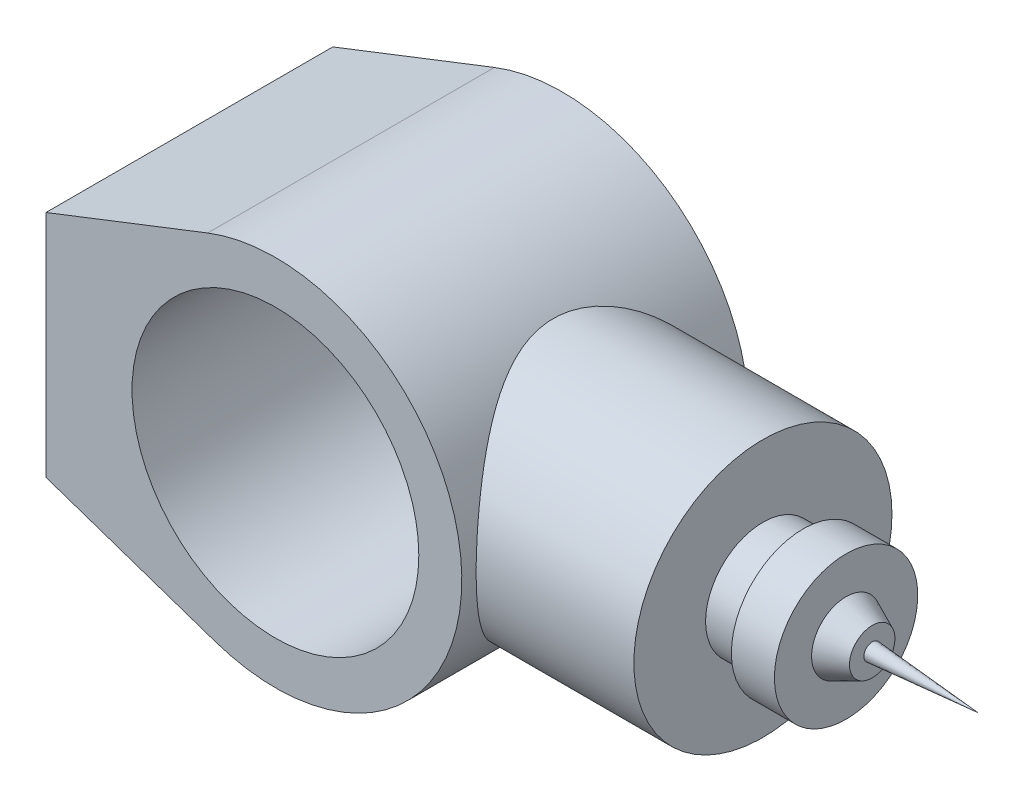
ISO-10303-21;
HEADER;
FILE_DESCRIPTION(('STEP AP214'),'2;1');
FILE_NAME('part.step','',(''),(''),'','','');
FILE_SCHEMA(('AUTOMOTIVE_DESIGN { 1 0 10303 214 1 1 1 1 }'));
ENDSEC;
DATA;
#1=APPLICATION_CONTEXT('core data for automotive mechanical design processes');
#2=APPLICATION_PROTOCOL_DEFINITION('international standard','automotive_design',2000,#1);
#3=PRODUCT_CONTEXT('',#1,'mechanical');
#4=PRODUCT('Part','Part','',(#3));
#5=PRODUCT_RELATED_PRODUCT_CATEGORY('part','',(#4));
#6=PRODUCT_DEFINITION_FORMATION('','',#4);
#7=PRODUCT_DEFINITION_CONTEXT('part definition',#1,'design');
#8=PRODUCT_DEFINITION('design','',#6,#7);
#9=PRODUCT_DEFINITION_SHAPE('','',#8);
#10=(LENGTH_UNIT() NAMED_UNIT(*) SI_UNIT(.MILLI.,.METRE.));
#11=(NAMED_UNIT(*) PLANE_ANGLE_UNIT() SI_UNIT($,.RADIAN.));
#12=(NAMED_UNIT(*) SI_UNIT($,.STERADIAN.) SOLID_ANGLE_UNIT());
#13=UNCERTAINTY_MEASURE_WITH_UNIT(LENGTH_MEASURE(1.E-05),#10,'distance_accuracy_value','');
#14=(GEOMETRIC_REPRESENTATION_CONTEXT(3) GLOBAL_UNCERTAINTY_ASSIGNED_CONTEXT((#13)) GLOBAL_UNIT_ASSIGNED_CONTEXT((#10,
#11,#12)) REPRESENTATION_CONTEXT('',''));
#15=CARTESIAN_POINT('',(0.,0.,0.));
#16=DIRECTION('',(0.,0.,1.));
#17=DIRECTION('',(1.,0.,0.));
#18=AXIS2_PLACEMENT_3D('',#15,#16,#17);
#19=CARTESIAN_POINT('',(0.,0.,50.));
#20=DIRECTION('',(0.,0.,-1.));
#21=DIRECTION('',(-1.,0.,0.));
#22=AXIS2_PLACEMENT_3D('',#19,#20,#21);
#23=CYLINDRICAL_SURFACE('',#22,65.);
#24=CARTESIAN_POINT('',(65.,0.,-45.));
#25=CARTESIAN_POINT('',(65.0000011696057,1.12147330120565,-45.0000012025283));
#26=CARTESIAN_POINT('',(64.9709159765212,2.24292945230778,-44.9580201602482));
#27=CARTESIAN_POINT('',(64.8553068641383,4.47658414079082,-44.790785609369));
#28=CARTESIAN_POINT('',(64.7687842573088,5.58878288911931,-44.6655340035371));
#29=CARTESIAN_POINT('',(64.5403785763001,7.79555151848628,-44.3336771879691));
#30=CARTESIAN_POINT('',(64.3984760503456,8.89011506447751,-44.1270433931238));
#31=CARTESIAN_POINT('',(64.0626457436966,11.0533096019768,-43.6354760134034));
#32=CARTESIAN_POINT('',(63.8687169569864,12.1219400915896,-43.3505409144375));
#33=CARTESIAN_POINT('',(63.4342222744662,14.2212125160505,-42.7078017297046));
#34=CARTESIAN_POINT('',(63.1938918545645,15.2520162370063,-42.3503651251477));
#35=CARTESIAN_POINT('',(62.6709259446924,17.2756280115286,-41.5659763086892));
#36=CARTESIAN_POINT('',(62.3882907364915,18.268436318107,-41.1390245597888));
#37=CARTESIAN_POINT('',(61.786108553932,20.2116697228795,-40.2199419970838));
#38=CARTESIAN_POINT('',(61.4665619062631,21.1620951960855,-39.7278117601444));
#39=CARTESIAN_POINT('',(60.7962171584065,23.0172309124314,-38.6825647509799));
#40=CARTESIAN_POINT('',(60.4454175300334,23.9219389167185,-38.1294449962195));
#41=CARTESIAN_POINT('',(59.6865648974474,25.7601880140228,-36.9151737617935));
#42=CARTESIAN_POINT('',(59.27618815402,26.6893215363404,-36.2488040005491));
#43=CARTESIAN_POINT('',(58.4330275057249,28.4880338622967,-34.8529502059224));
#44=CARTESIAN_POINT('',(58.0002425478181,29.3576098626539,-34.1234632053608));
#45=CARTESIAN_POINT('',(57.1195111836477,31.0364486388513,-32.6040251352403));
#46=CARTESIAN_POINT('',(56.6715447181891,31.8456267033451,-31.8139921794123));
#47=CARTESIAN_POINT('',(55.7691986061138,33.4006700551814,-30.1773036556993));
#48=CARTESIAN_POINT('',(55.3148185876119,34.1465316534289,-29.3306447936721));
#49=CARTESIAN_POINT('',(54.3303114345595,35.6959084068904,-27.4326466159468));
#50=CARTESIAN_POINT('',(53.8005937511269,36.4872853280241,-26.3711450656527));
#51=CARTESIAN_POINT('',(52.7593327891933,37.9773509509911,-24.17604025639));
#52=CARTESIAN_POINT('',(52.2477941160227,38.6760162868262,-23.0424189272517));
#53=CARTESIAN_POINT('',(51.2608149265043,39.9749077721744,-20.7072341856928));
#54=CARTESIAN_POINT('',(50.7853275075273,40.5752630453964,-19.5057627267967));
#55=CARTESIAN_POINT('',(49.8892399163793,41.6721166930025,-17.036931864064));
#56=CARTESIAN_POINT('',(49.4686114171658,42.1686687478853,-15.7696069409943));
#57=CARTESIAN_POINT('',(48.8208029416879,42.9149535309565,-13.5723996352816));
#58=CARTESIAN_POINT('',(48.5738420263557,43.1936925213245,-12.6581208440976));
#59=CARTESIAN_POINT('',(48.1238801744123,43.6944569649788,-10.8035389223551));
#60=CARTESIAN_POINT('',(47.9208721021929,43.9164916250901,-9.86324004407419));
#61=CARTESIAN_POINT('',(47.5660754926548,44.3005296261305,-7.96250438663409));
#62=CARTESIAN_POINT('',(47.4142038087044,44.4626304606427,-7.00210302149487));
#63=CARTESIAN_POINT('',(47.1671263845177,44.7246555122386,-5.06554052628518));
#64=CARTESIAN_POINT('',(47.0719206259529,44.824579749433,-4.08937940131224));
#65=CARTESIAN_POINT('',(46.9418899090943,44.9607388198673,-2.1232364847967));
#66=CARTESIAN_POINT('',(46.9073939345417,44.9966266570423,-1.13320851844658));
#67=CARTESIAN_POINT('',(46.9013571135476,45.0029190462422,0.847248377093852));
#68=CARTESIAN_POINT('',(46.9298161498631,44.9733237202183,1.837677305534));
#69=CARTESIAN_POINT('',(47.0484302849821,44.8492190899201,3.81128752429081));
#70=CARTESIAN_POINT('',(47.13862305521,44.7546701492421,4.79446401850661));
#71=CARTESIAN_POINT('',(47.3768313176079,44.5024241630868,6.74551496467455));
#72=CARTESIAN_POINT('',(47.5248480621437,44.3447257499009,7.71338908473168));
#73=CARTESIAN_POINT('',(47.8621764271841,43.9803320764262,9.56919366964684));
#74=CARTESIAN_POINT('',(48.0484149088864,43.7772163066585,10.4583970625519));
#75=CARTESIAN_POINT('',(48.4609441046406,43.32010640119,12.2144143492181));
#76=CARTESIAN_POINT('',(48.6872496045115,43.0660934784815,13.0812198417583));
#77=CARTESIAN_POINT('',(49.1738509640383,42.5096331932465,14.7898225666927));
#78=CARTESIAN_POINT('',(49.4341648638834,42.2071601049958,15.6316062329481));
#79=CARTESIAN_POINT('',(49.9825182796335,41.5563350032134,17.2876417419013));
#80=CARTESIAN_POINT('',(50.2705534011697,41.2079902580444,18.1018979206949));
#81=CARTESIAN_POINT('',(51.0225431471345,40.2767822129268,20.1137766396802));
#82=CARTESIAN_POINT('',(51.5007434523328,39.6654891440572,21.2930273345177));
#83=CARTESIAN_POINT('',(52.4891158781477,38.348029920852,23.5833678403921));
#84=CARTESIAN_POINT('',(52.9993005340589,37.6418264436726,24.6944305853524));
#85=CARTESIAN_POINT('',(54.0361557973494,36.1376496350166,26.8476775780095));
#86=CARTESIAN_POINT('',(54.5628535785461,35.3395185623559,27.8897384505711));
#87=CARTESIAN_POINT('',(55.6171804467178,33.6558443419671,29.8998791095632));
#88=CARTESIAN_POINT('',(56.1448094104418,32.7703120184234,30.8679680307498));
#89=CARTESIAN_POINT('',(57.1932449701135,30.9045304086319,32.7363921475659));
#90=CARTESIAN_POINT('',(57.7139191350983,29.9233731295192,33.6358963165067));
#91=CARTESIAN_POINT('',(58.7296419536465,27.8771206485979,35.350355349792));
#92=CARTESIAN_POINT('',(59.2246882700661,26.8120178135979,36.1653025097018));
#93=CARTESIAN_POINT('',(60.1756566955639,24.6035209522421,37.7024332048813));
#94=CARTESIAN_POINT('',(60.6316475651595,23.4602711709794,38.4247809320632));
#95=CARTESIAN_POINT('',(61.4931891608211,21.0989507187335,39.7703323765769));
#96=CARTESIAN_POINT('',(61.898755017873,19.8809026570889,40.3935658507715));
#97=CARTESIAN_POINT('',(62.5646802947783,17.6549035875762,41.4059204565395));
#98=CARTESIAN_POINT('',(62.8372982548467,16.6602403417733,41.8163120535009));
#99=CARTESIAN_POINT('',(63.3397164077328,14.6345031625144,42.5675669112335));
#100=CARTESIAN_POINT('',(63.569522535998,13.603434299959,42.9084398107234));
#101=CARTESIAN_POINT('',(63.9815049902596,11.5110112910016,43.5164676119118));
#102=CARTESIAN_POINT('',(64.1637052650743,10.4496726714621,43.7836595836378));
#103=CARTESIAN_POINT('',(64.476639865795,8.30296993183371,44.2409869387356));
#104=CARTESIAN_POINT('',(64.6073730982257,7.21760530180254,44.431120684921));
#105=CARTESIAN_POINT('',(64.8147345736682,5.02649787175023,44.7321113931983));
#106=CARTESIAN_POINT('',(64.8911534961694,3.92069290489763,44.8426616714377));
#107=CARTESIAN_POINT('',(64.9872183357685,1.70145350776208,44.981563734156));
#108=CARTESIAN_POINT('',(65.0068642771874,0.588019080747696,45.0099155538474));
#109=CARTESIAN_POINT('',(64.9889001241945,-1.63741781931566,44.9839662509349));
#110=CARTESIAN_POINT('',(64.9512898349751,-2.74942028747967,44.929664847113));
#111=CARTESIAN_POINT('',(64.819734418053,-4.96298947367603,44.7392747901952));
#112=CARTESIAN_POINT('',(64.7257910494465,-6.06455651648127,44.6031886909653));
#113=CARTESIAN_POINT('',(64.491175703309,-8.18254449212149,44.2620157992034));
#114=CARTESIAN_POINT('',(64.3536808680178,-9.20007959997774,44.0616107864454));
#115=CARTESIAN_POINT('',(64.0337856060908,-11.2121337136589,43.5930613516679));
#116=CARTESIAN_POINT('',(63.8513873855499,-12.2066538475799,43.3249202574929));
#117=CARTESIAN_POINT('',(63.4451725249075,-14.1673074608523,42.7239854011605));
#118=CARTESIAN_POINT('',(63.2213525684632,-15.1334386601223,42.3911864622047));
#119=CARTESIAN_POINT('',(62.736336352677,-17.0327019487273,41.6643868113868));
#120=CARTESIAN_POINT('',(62.4751380044848,-17.965832190203,41.2703826790343));
#121=CARTESIAN_POINT('',(61.8990085085122,-19.8637431772395,40.3931275129008));
#122=CARTESIAN_POINT('',(61.5815209528501,-20.8256806929253,39.9054081529014));
#123=CARTESIAN_POINT('',(60.9142086391395,-22.7035764997345,38.8677076181211));
#124=CARTESIAN_POINT('',(60.5643826081083,-23.6195329786528,38.3177239921568));
#125=CARTESIAN_POINT('',(59.8381347129401,-25.4032558353403,37.1592008079418));
#126=CARTESIAN_POINT('',(59.4616987975441,-26.270996314329,36.5506302507532));
#127=CARTESIAN_POINT('',(58.6884577670336,-27.9557544991496,35.2787474176625));
#128=CARTESIAN_POINT('',(58.2916515549571,-28.7727694681138,34.6154321925309));
#129=CARTESIAN_POINT('',(57.4151711853793,-30.4889708749912,33.1199200847161));
#130=CARTESIAN_POINT('',(56.9328754552547,-31.3785212006928,32.2781812569548));
#131=CARTESIAN_POINT('',(55.9590893109094,-33.0839042215169,30.5278352445589));
#132=CARTESIAN_POINT('',(55.4675975421249,-33.8997259516808,29.6192181500899));
#133=CARTESIAN_POINT('',(54.4860350387397,-35.45586994741,27.7375714933993));
#134=CARTESIAN_POINT('',(53.9959654596117,-36.1961418986443,26.7644997080007));
#135=CARTESIAN_POINT('',(53.0294834997435,-37.5978502361011,24.7568233036382));
#136=CARTESIAN_POINT('',(52.553069328415,-38.2592969946585,23.7222268074148));
#137=CARTESIAN_POINT('',(51.679941347726,-39.4291013564639,21.7149007388747));
#138=CARTESIAN_POINT('',(51.2803372484816,-39.9463152685162,20.7485884228094));
#139=CARTESIAN_POINT('',(50.5123974548912,-40.9130636661729,18.7705314851885));
#140=CARTESIAN_POINT('',(50.1440619804653,-41.3625976757848,17.7587865441704));
#141=CARTESIAN_POINT('',(49.4504928922364,-42.1893301292689,15.693797265063));
#142=CARTESIAN_POINT('',(49.1251906412473,-42.566644202947,14.6406225749502));
#143=CARTESIAN_POINT('',(48.5290098021012,-43.2451098617227,12.4950157035289));
#144=CARTESIAN_POINT('',(48.2581179989952,-43.5462799449171,11.4025931307277));
#145=CARTESIAN_POINT('',(47.8271610412375,-44.0186874861181,9.3921629994351));
#146=CARTESIAN_POINT('',(47.6558419905218,-44.2036946073207,8.47979353570419));
#147=CARTESIAN_POINT('',(47.3627606953031,-44.517583244497,6.63757582668245));
#148=CARTESIAN_POINT('',(47.2409923142224,-44.6464717105955,5.70772976070373));
#149=CARTESIAN_POINT('',(47.05166615705,-44.8459556683364,3.83718735816971));
#150=CARTESIAN_POINT('',(46.9840561376509,-44.9166073394187,2.89650236820514));
#151=CARTESIAN_POINT('',(46.9055698265682,-44.9985645522097,1.01014116515035));
#152=CARTESIAN_POINT('',(46.894694331428,-45.0098692606967,0.0644648821697862));
#153=CARTESIAN_POINT('',(46.9301408777119,-44.972908524549,-1.82506201386804));
#154=CARTESIAN_POINT('',(46.9764888551696,-44.9246160680299,-2.76891160474201));
#155=CARTESIAN_POINT('',(47.1245232303033,-44.7693052695385,-4.64731891289862));
#156=CARTESIAN_POINT('',(47.226209296244,-44.6622872796082,-5.58187668584874));
#157=CARTESIAN_POINT('',(47.4811423262629,-44.3911660407895,-7.43666598606561));
#158=CARTESIAN_POINT('',(47.634452919394,-44.2269923369625,-8.35687836049678));
#159=CARTESIAN_POINT('',(47.9871889035597,-43.8440109221367,-10.1768310643423));
#160=CARTESIAN_POINT('',(48.1866204648689,-43.6251959006593,-11.0765686368372));
#161=CARTESIAN_POINT('',(48.6908782922366,-43.0625185245671,-13.116726178063));
#162=CARTESIAN_POINT('',(49.0093972350599,-42.7008255731353,-14.2488681052183));
#163=CARTESIAN_POINT('',(49.699554494161,-41.8955268796886,-16.4668795226373));
#164=CARTESIAN_POINT('',(50.0712093704162,-41.4518955887103,-17.5527344499461));
#165=CARTESIAN_POINT('',(50.8544123719762,-40.4872212981013,-19.6760329984318));
#166=CARTESIAN_POINT('',(51.2660067549033,-39.9660881554129,-20.7134183727638));
#167=CARTESIAN_POINT('',(52.116211879306,-38.8508952329155,-22.7363587217865));
#168=CARTESIAN_POINT('',(52.5548209260535,-38.2568400254561,-23.7219169406072));
#169=CARTESIAN_POINT('',(53.4579357785502,-36.9847423381263,-25.6613286822633));
#170=CARTESIAN_POINT('',(53.9228021101371,-36.3051118639051,-26.6139712103077));
#171=CARTESIAN_POINT('',(54.8583333343946,-34.8753950985048,-28.4617532840731));
#172=CARTESIAN_POINT('',(55.3289982185488,-34.1253089107936,-29.3568929142368));
#173=CARTESIAN_POINT('',(56.2664339133503,-32.5564691651912,-31.0876310121466));
#174=CARTESIAN_POINT('',(56.7332035093429,-31.7376950080829,-31.923211478402));
#175=CARTESIAN_POINT('',(57.6535165855435,-30.033481652025,-33.5315189390535));
#176=CARTESIAN_POINT('',(58.1070588196762,-29.1480362003111,-34.3042400240121));
#177=CARTESIAN_POINT('',(59.0635284336244,-27.1643113596245,-35.9022819462667));
#178=CARTESIAN_POINT('',(59.5626106290919,-26.0547472869609,-36.7159606163356));
#179=CARTESIAN_POINT('',(60.5176757229357,-23.7521280348398,-38.2458641369291));
#180=CARTESIAN_POINT('',(60.9736519283074,-22.5590599397198,-38.962073861155));
#181=CARTESIAN_POINT('',(61.6149926579414,-20.7127348127311,-39.9558623322098));
#182=CARTESIAN_POINT('',(61.8215919655179,-20.088110583999,-40.2735888165198));
#183=CARTESIAN_POINT('',(62.2191547005856,-18.8206694867556,-40.8812436548858));
#184=CARTESIAN_POINT('',(62.4101203779565,-18.1778552539997,-41.1711760099034));
#185=CARTESIAN_POINT('',(62.7748527233683,-16.875283117665,-41.7219931318356));
#186=CARTESIAN_POINT('',(62.9486230408552,-16.2155288469421,-41.9828840638124));
#187=CARTESIAN_POINT('',(63.2775356475737,-14.8804011558233,-42.4744610119283));
#188=CARTESIAN_POINT('',(63.432679284421,-14.2050288695917,-42.7051492133046));
#189=CARTESIAN_POINT('',(63.8070721968101,-12.4447010544915,-43.25974494481));
#190=CARTESIAN_POINT('',(64.0114184468014,-11.3490405228654,-43.5602757498286));
#191=CARTESIAN_POINT('',(64.3654191982087,-9.12991345978806,-44.078827644396));
#192=CARTESIAN_POINT('',(64.5150820049425,-8.00645117856259,-44.2968612637911));
#193=CARTESIAN_POINT('',(64.7559993187061,-5.74082253729113,-44.6470112993716));
#194=CARTESIAN_POINT('',(64.847297757104,-4.59867091062173,-44.7791923387443));
#195=CARTESIAN_POINT('',(64.9692976296881,-2.30434018473195,-44.9556862638234));
#196=CARTESIAN_POINT('',(64.9999987983895,-1.15216104160189,-44.999998764566));
#197=CARTESIAN_POINT('',(65.,0.,-45.));
#198=B_SPLINE_CURVE_WITH_KNOTS('',3,(#24,#25,#26,#27,#28,#29,#30,#31,#32,#33,#34,#35,#36,#37,
#38,#39,#40,#41,#42,#43,#44,#45,#46,#47,#48,#49,#50,#51,#52,#53,#54,#55,#56,#57,#58,#59,#60,#61,
#62,#63,#64,#65,#66,#67,#68,#69,#70,#71,#72,#73,#74,#75,#76,#77,#78,#79,#80,#81,#82,#83,#84,#85,
#86,#87,#88,#89,#90,#91,#92,#93,#94,#95,#96,#97,#98,#99,#100,#101,#102,#103,#104,#105,#106,#107,
#108,#109,#110,#111,#112,#113,#114,#115,#116,#117,#118,#119,#120,#121,#122,#123,#124,#125,#126,
#127,#128,#129,#130,#131,#132,#133,#134,#135,#136,#137,#138,#139,#140,#141,#142,#143,#144,#145,
#146,#147,#148,#149,#150,#151,#152,#153,#154,#155,#156,#157,#158,#159,#160,#161,#162,#163,#164,
#165,#166,#167,#168,#169,#170,#171,#172,#173,#174,#175,#176,#177,#178,#179,#180,#181,#182,#183,
#184,#185,#186,#187,#188,#189,#190,#191,#192,#193,#194,#195,#196,#197),.UNSPECIFIED.,.T.,.F.,(4,
2,2,2,2,2,2,2,2,2,2,2,2,2,2,2,2,2,2,2,2,2,2,2,2,2,2,2,2,2,2,2,2,2,2,2,2,2,2,2,2,2,2,2,2,2,2,2,2,
2,2,2,2,2,2,2,2,2,2,2,2,2,2,2,2,2,2,2,2,2,2,2,2,2,2,2,2,2,2,2,2,2,2,2,2,2,4),(0.,
3.36323892794144,6.72640100710137,10.0907454360665,13.4551549250109,16.8029195613731,
20.1506619010729,23.4983746134034,26.8462511096753,30.4871649037346,34.1282499524345,
37.7743494260164,41.4206611917409,45.6939383064405,49.9682903731881,54.2369825353392,
58.5034617073671,61.4625138492405,64.4210852373372,67.3748225577202,70.3285589227263,
73.2982527376573,76.2679410220407,79.2394430998938,82.2110095388412,85.0011411726389,
87.7923045951578,90.584954683776,93.3771628083065,97.6064034875675,101.837312178738,
106.075592113262,110.313347816192,114.596218662803,118.879479402292,123.155037051935,
127.429308626693,130.755998382163,134.082226580387,137.406778235214,140.731400520075,
144.068767009318,147.406132068879,150.743508483461,154.080780688207,157.215791533369,
160.350648386749,163.485756334407,166.621039552604,169.990545063149,173.360183268584,
176.73161428665,180.103227050672,184.047902440152,187.993163521895,191.94103513809,
195.888386692538,199.385185586645,202.88200907258,206.373186157811,209.863514294626,
212.700365177753,215.536864625513,218.370624567028,221.204424293963,224.039508887241,
226.874576485218,229.713151272815,232.55210603787,236.23803941247,239.925124033801,
243.616531168718,247.307706963636,251.081871120678,254.856029735252,258.631324277359,
262.406973327354,266.792058434818,271.177823293658,273.368885604935,275.55963203795,
277.749912517597,279.940034437727,283.398420446896,286.856280978073,290.31153567335,
293.766805506531),.UNSPECIFIED.);
#199=CARTESIAN_POINT('',(65.,0.,-45.));
#200=VERTEX_POINT('',#199);
#201=EDGE_CURVE('E60',#200,#200,#198,.T.);
#202=ORIENTED_EDGE('',*,*,#201,.F.);
#203=EDGE_LOOP('',(#202));
#204=FACE_BOUND('',#203,.T.);
#205=ADVANCED_FACE('F52',(#204),#23,.F.);
#206=CARTESIAN_POINT('',(-80.002,0.,0.));
#207=DIRECTION('',(1.,0.,0.));
#208=DIRECTION('',(0.,0.,-1.));
#209=AXIS2_PLACEMENT_3D('',#206,#207,#208);
#210=CYLINDRICAL_SURFACE('',#209,45.);
#211=ORIENTED_EDGE('',*,*,#201,.T.);
#212=EDGE_LOOP('',(#211));
#213=FACE_BOUND('',#212,.T.);
#214=CARTESIAN_POINT('',(120.,0.,0.));
#215=DIRECTION('',(1.,0.,0.));
#216=DIRECTION('',(0.,0.,-1.));
#217=AXIS2_PLACEMENT_3D('',#214,#215,#216);
#218=CIRCLE('',#217,45.);
#219=CARTESIAN_POINT('',(120.,0.,-45.));
#220=VERTEX_POINT('',#219);
#221=EDGE_CURVE('E12',#220,#220,#218,.T.);
#222=ORIENTED_EDGE('',*,*,#221,.F.);
#223=EDGE_LOOP('',(#222));
#224=FACE_BOUND('',#223,.T.);
#225=ADVANCED_FACE('F54',(#213,#224),#210,.T.);
#226=CARTESIAN_POINT('',(120.,0.,0.));
#227=DIRECTION('',(1.,0.,0.));
#228=DIRECTION('',(0.,0.,-1.));
#229=AXIS2_PLACEMENT_3D('',#226,#227,#228);
#230=PLANE('',#229);
#231=CARTESIAN_POINT('',(120.,0.,0.));
#232=DIRECTION('',(-1.,0.,0.));
#233=DIRECTION('',(0.,0.,1.));
#234=AXIS2_PLACEMENT_3D('',#231,#232,#233);
#235=CIRCLE('',#234,20.);
#236=CARTESIAN_POINT('',(120.,0.,20.));
#237=VERTEX_POINT('',#236);
#238=EDGE_CURVE('E89',#237,#237,#235,.T.);
#239=ORIENTED_EDGE('',*,*,#238,.T.);
#240=EDGE_LOOP('',(#239));
#241=FACE_BOUND('',#240,.T.);
#242=ORIENTED_EDGE('',*,*,#221,.T.);
#243=EDGE_LOOP('',(#242));
#244=FACE_BOUND('',#243,.T.);
#245=ADVANCED_FACE('F100',(#241,#244),#230,.T.);
#246=CARTESIAN_POINT('',(-80.,0.,0.));
#247=DIRECTION('',(-1.,0.,0.));
#248=DIRECTION('',(0.,0.,1.));
#249=AXIS2_PLACEMENT_3D('',#246,#247,#248);
#250=CYLINDRICAL_SURFACE('',#249,20.);
#251=CARTESIAN_POINT('',(134.,0.,0.));
#252=DIRECTION('',(-1.,0.,0.));
#253=DIRECTION('',(0.,0.,1.));
#254=AXIS2_PLACEMENT_3D('',#251,#252,#253);
#255=CIRCLE('',#254,20.);
#256=CARTESIAN_POINT('',(134.,0.,20.));
#257=VERTEX_POINT('',#256);
#258=EDGE_CURVE('E86',#257,#257,#255,.T.);
#259=ORIENTED_EDGE('',*,*,#258,.T.);
#260=EDGE_LOOP('',(#259));
#261=FACE_BOUND('',#260,.T.);
#262=ORIENTED_EDGE('',*,*,#238,.F.);
#263=EDGE_LOOP('',(#262));
#264=FACE_BOUND('',#263,.T.);
#265=ADVANCED_FACE('F101',(#261,#264),#250,.T.);
#266=CARTESIAN_POINT('',(134.,-20.,0.));
#267=DIRECTION('',(-1.,0.,0.));
#268=DIRECTION('',(0.,0.,1.));
#269=AXIS2_PLACEMENT_3D('',#266,#267,#268);
#270=PLANE('',#269);
#271=CARTESIAN_POINT('',(134.,0.,0.));
#272=DIRECTION('',(-1.,0.,0.));
#273=DIRECTION('',(0.,0.,1.));
#274=AXIS2_PLACEMENT_3D('',#271,#272,#273);
#275=CIRCLE('',#274,25.);
#276=CARTESIAN_POINT('',(134.,0.,25.));
#277=VERTEX_POINT('',#276);
#278=EDGE_CURVE('E83',#277,#277,#275,.T.);
#279=ORIENTED_EDGE('',*,*,#278,.T.);
#280=EDGE_LOOP('',(#279));
#281=FACE_BOUND('',#280,.T.);
#282=ORIENTED_EDGE('',*,*,#258,.F.);
#283=EDGE_LOOP('',(#282));
#284=FACE_BOUND('',#283,.T.);
#285=ADVANCED_FACE('F109',(#281,#284),#270,.T.);
#286=CARTESIAN_POINT('',(-80.,0.,0.));
#287=DIRECTION('',(-1.,0.,0.));
#288=DIRECTION('',(0.,0.,1.));
#289=AXIS2_PLACEMENT_3D('',#286,#287,#288);
#290=CYLINDRICAL_SURFACE('',#289,25.);
#291=CARTESIAN_POINT('',(149.,0.,0.));
#292=DIRECTION('',(-1.,0.,0.));
#293=DIRECTION('',(0.,0.,1.));
#294=AXIS2_PLACEMENT_3D('',#291,#292,#293);
#295=CIRCLE('',#294,25.);
#296=CARTESIAN_POINT('',(149.,0.,25.));
#297=VERTEX_POINT('',#296);
#298=EDGE_CURVE('E80',#297,#297,#295,.T.);
#299=ORIENTED_EDGE('',*,*,#298,.T.);
#300=EDGE_LOOP('',(#299));
#301=FACE_BOUND('',#300,.T.);
#302=ORIENTED_EDGE('',*,*,#278,.F.);
#303=EDGE_LOOP('',(#302));
#304=FACE_BOUND('',#303,.T.);
#305=ADVANCED_FACE('F156',(#301,#304),#290,.T.);
#306=CARTESIAN_POINT('',(149.,-25.,0.));
#307=DIRECTION('',(1.,0.,0.));
#308=DIRECTION('',(0.,0.,-1.));
#309=AXIS2_PLACEMENT_3D('',#306,#307,#308);
#310=PLANE('',#309);
#311=CARTESIAN_POINT('',(149.,0.,0.));
#312=DIRECTION('',(-1.,0.,0.));
#313=DIRECTION('',(0.,0.,1.));
#314=AXIS2_PLACEMENT_3D('',#311,#312,#313);
#315=CIRCLE('',#314,12.0357703467711);
#316=CARTESIAN_POINT('',(149.,0.,12.0357703467711));
#317=VERTEX_POINT('',#316);
#318=EDGE_CURVE('E75',#317,#317,#315,.T.);
#319=ORIENTED_EDGE('',*,*,#318,.T.);
#320=EDGE_LOOP('',(#319));
#321=FACE_BOUND('',#320,.T.);
#322=ORIENTED_EDGE('',*,*,#298,.F.);
#323=EDGE_LOOP('',(#322));
#324=FACE_BOUND('',#323,.T.);
#325=ADVANCED_FACE('F167',(#321,#324),#310,.T.);
#326=CARTESIAN_POINT('',(149.,0.,0.));
#327=DIRECTION('',(-1.,0.,0.));
#328=DIRECTION('',(0.,0.,1.));
#329=AXIS2_PLACEMENT_3D('',#326,#327,#328);
#330=CONICAL_SURFACE('',#329,12.0357703467711,0.42369671357811);
#331=CARTESIAN_POINT('',(158.115753311534,0.,0.));
#332=DIRECTION('',(-1.,0.,0.));
#333=DIRECTION('',(0.,0.,1.));
#334=AXIS2_PLACEMENT_3D('',#331,#332,#333);
#335=CIRCLE('',#334,7.92443947182847);
#336=CARTESIAN_POINT('',(158.115753311534,0.,7.92443947182847));
#337=VERTEX_POINT('',#336);
#338=EDGE_CURVE('E72',#337,#337,#335,.T.);
#339=ORIENTED_EDGE('',*,*,#338,.T.);
#340=EDGE_LOOP('',(#339));
#341=FACE_BOUND('',#340,.T.);
#342=ORIENTED_EDGE('',*,*,#318,.F.);
#343=EDGE_LOOP('',(#342));
#344=FACE_BOUND('',#343,.T.);
#345=ADVANCED_FACE('F179',(#341,#344),#330,.T.);
#346=CARTESIAN_POINT('',(158.115753311534,-7.92443947182847,0.));
#347=DIRECTION('',(1.,0.,0.));
#348=DIRECTION('',(0.,0.,-1.));
#349=AXIS2_PLACEMENT_3D('',#346,#347,#348);
#350=PLANE('',#349);
#351=CARTESIAN_POINT('',(158.115753311534,0.,0.));
#352=DIRECTION('',(-1.,0.,0.));
#353=DIRECTION('',(0.,0.,1.));
#354=AXIS2_PLACEMENT_3D('',#351,#352,#353);
#355=CIRCLE('',#354,2.92443947182847);
#356=CARTESIAN_POINT('',(158.115753311534,0.,2.92443947182847));
#357=VERTEX_POINT('',#356);
#358=EDGE_CURVE('E70',#357,#357,#355,.T.);
#359=ORIENTED_EDGE('',*,*,#358,.T.);
#360=EDGE_LOOP('',(#359));
#361=FACE_BOUND('',#360,.T.);
#362=ORIENTED_EDGE('',*,*,#338,.F.);
#363=EDGE_LOOP('',(#362));
#364=FACE_BOUND('',#363,.T.);
#365=ADVANCED_FACE('F66',(#361,#364),#350,.T.);
#366=CARTESIAN_POINT('',(158.115753311534,0.,0.));
#367=DIRECTION('',(-1.,0.,0.));
#368=DIRECTION('',(0.,0.,1.));
#369=AXIS2_PLACEMENT_3D('',#366,#367,#368);
#370=CONICAL_SURFACE('',#369,2.92443947182847,0.0791214314844104);
#371=CARTESIAN_POINT('',(195.,0.,0.));
#372=VERTEX_POINT('',#371);
#373=VERTEX_LOOP('',#372);
#374=FACE_BOUND('',#373,.T.);
#375=ORIENTED_EDGE('',*,*,#358,.F.);
#376=EDGE_LOOP('',(#375));
#377=FACE_BOUND('',#376,.T.);
#378=ADVANCED_FACE('F63',(#374,#377),#370,.T.);
#379=CLOSED_SHELL('',(#205,#225,#245,#265,#285,#305,#325,#345,#365,#378));
#380=MANIFOLD_SOLID_BREP('B2',#379);
#381=CARTESIAN_POINT('',(0.,0.,50.));
#382=DIRECTION('',(0.,0.,1.));
#383=DIRECTION('',(1.,0.,0.));
#384=AXIS2_PLACEMENT_3D('',#381,#382,#383);
#385=PLANE('',#384);
#386=DIRECTION('',(0.946686924841295,-0.322155034625462,0.));
#387=VECTOR('',#386,1.);
#388=CARTESIAN_POINT('',(-80.,-41.4367159835225,50.));
#389=LINE('',#388,#387);
#390=CARTESIAN_POINT('',(-80.,-41.4367159835225,50.));
#391=VERTEX_POINT('',#390);
#392=CARTESIAN_POINT('',(-20.940077250655,-61.5346501146842,50.));
#393=VERTEX_POINT('',#392);
#394=EDGE_CURVE('E292',#391,#393,#389,.T.);
#395=ORIENTED_EDGE('',*,*,#394,.T.);
#396=CARTESIAN_POINT('',(0.,0.,50.));
#397=DIRECTION('',(0.,0.,1.));
#398=DIRECTION('',(1.,0.,0.));
#399=AXIS2_PLACEMENT_3D('',#396,#397,#398);
#400=CIRCLE('',#399,65.);
#401=CARTESIAN_POINT('',(-23.6221646470768,60.555704416565,50.));
#402=VERTEX_POINT('',#401);
#403=EDGE_CURVE('E287',#393,#402,#400,.T.);
#404=ORIENTED_EDGE('',*,*,#403,.T.);
#405=DIRECTION('',(-0.931626221793308,-0.363417917647335,0.));
#406=VECTOR('',#405,1.);
#407=CARTESIAN_POINT('',(-80.,38.5632840164775,50.));
#408=LINE('',#407,#406);
#409=CARTESIAN_POINT('',(-80.,38.5632840164775,50.));
#410=VERTEX_POINT('',#409);
#411=EDGE_CURVE('E290',#402,#410,#408,.T.);
#412=ORIENTED_EDGE('',*,*,#411,.T.);
#413=DIRECTION('',(0.,-1.,0.));
#414=VECTOR('',#413,1.);
#415=CARTESIAN_POINT('',(-80.,38.5632840164775,50.));
#416=LINE('',#415,#414);
#417=EDGE_CURVE('E257',#410,#391,#416,.T.);
#418=ORIENTED_EDGE('',*,*,#417,.T.);
#419=EDGE_LOOP('',(#395,#404,#412,#418));
#420=FACE_BOUND('',#419,.T.);
#421=CARTESIAN_POINT('',(0.,0.,50.));
#422=DIRECTION('',(0.,0.,1.));
#423=DIRECTION('',(1.,0.,0.));
#424=AXIS2_PLACEMENT_3D('',#421,#422,#423);
#425=CIRCLE('',#424,50.);
#426=CARTESIAN_POINT('',(50.,0.,50.));
#427=VERTEX_POINT('',#426);
#428=EDGE_CURVE('E307',#427,#427,#425,.T.);
#429=ORIENTED_EDGE('',*,*,#428,.F.);
#430=EDGE_LOOP('',(#429));
#431=FACE_BOUND('',#430,.T.);
#432=ADVANCED_FACE('F240',(#420,#431),#385,.T.);
#433=CARTESIAN_POINT('',(0.,0.,-50.));
#434=DIRECTION('',(0.,0.,1.));
#435=DIRECTION('',(1.,0.,0.));
#436=AXIS2_PLACEMENT_3D('',#433,#434,#435);
#437=PLANE('',#436);
#438=DIRECTION('',(0.946686924841295,-0.322155034625462,0.));
#439=VECTOR('',#438,1.);
#440=CARTESIAN_POINT('',(-80.,-41.4367159835225,-50.));
#441=LINE('',#440,#439);
#442=CARTESIAN_POINT('',(-80.,-41.4367159835225,-50.));
#443=VERTEX_POINT('',#442);
#444=CARTESIAN_POINT('',(-20.940077250655,-61.5346501146842,-50.));
#445=VERTEX_POINT('',#444);
#446=EDGE_CURVE('E304',#443,#445,#441,.T.);
#447=ORIENTED_EDGE('',*,*,#446,.F.);
#448=DIRECTION('',(0.,-1.,0.));
#449=VECTOR('',#448,1.);
#450=CARTESIAN_POINT('',(-80.,38.5632840164775,-50.));
#451=LINE('',#450,#449);
#452=CARTESIAN_POINT('',(-80.,38.5632840164775,-50.));
#453=VERTEX_POINT('',#452);
#454=EDGE_CURVE('E280',#453,#443,#451,.T.);
#455=ORIENTED_EDGE('',*,*,#454,.F.);
#456=DIRECTION('',(-0.931626221793308,-0.363417917647335,0.));
#457=VECTOR('',#456,1.);
#458=CARTESIAN_POINT('',(-80.,38.5632840164775,-50.));
#459=LINE('',#458,#457);
#460=CARTESIAN_POINT('',(-23.6221646470768,60.555704416565,-50.));
#461=VERTEX_POINT('',#460);
#462=EDGE_CURVE('E274',#461,#453,#459,.T.);
#463=ORIENTED_EDGE('',*,*,#462,.F.);
#464=CARTESIAN_POINT('',(0.,0.,-50.));
#465=DIRECTION('',(0.,0.,1.));
#466=DIRECTION('',(1.,0.,0.));
#467=AXIS2_PLACEMENT_3D('',#464,#465,#466);
#468=CIRCLE('',#467,65.);
#469=EDGE_CURVE('E296',#445,#461,#468,.T.);
#470=ORIENTED_EDGE('',*,*,#469,.F.);
#471=EDGE_LOOP('',(#447,#455,#463,#470));
#472=FACE_BOUND('',#471,.T.);
#473=CARTESIAN_POINT('',(0.,0.,-50.));
#474=DIRECTION('',(0.,0.,1.));
#475=DIRECTION('',(1.,0.,0.));
#476=AXIS2_PLACEMENT_3D('',#473,#474,#475);
#477=CIRCLE('',#476,50.);
#478=CARTESIAN_POINT('',(50.,0.,-50.));
#479=VERTEX_POINT('',#478);
#480=EDGE_CURVE('E319',#479,#479,#477,.T.);
#481=ORIENTED_EDGE('',*,*,#480,.T.);
#482=EDGE_LOOP('',(#481));
#483=FACE_BOUND('',#482,.T.);
#484=ADVANCED_FACE('F315',(#472,#483),#437,.F.);
#485=CARTESIAN_POINT('',(-80.,-41.4367159835225,50.));
#486=DIRECTION('',(0.322155034625462,0.946686924841295,0.));
#487=DIRECTION('',(-0.946686924841295,0.322155034625462,0.));
#488=AXIS2_PLACEMENT_3D('',#485,#486,#487);
#489=PLANE('',#488);
#490=ORIENTED_EDGE('',*,*,#446,.T.);
#491=DIRECTION('',(0.,0.,-1.));
#492=VECTOR('',#491,1.);
#493=CARTESIAN_POINT('',(-20.940077250655,-61.5346501146842,50.));
#494=LINE('',#493,#492);
#495=EDGE_CURVE('E50',#393,#445,#494,.T.);
#496=ORIENTED_EDGE('',*,*,#495,.F.);
#497=ORIENTED_EDGE('',*,*,#394,.F.);
#498=DIRECTION('',(0.,0.,-1.));
#499=VECTOR('',#498,1.);
#500=CARTESIAN_POINT('',(-80.,-41.4367159835225,50.));
#501=LINE('',#500,#499);
#502=EDGE_CURVE('E300',#391,#443,#501,.T.);
#503=ORIENTED_EDGE('',*,*,#502,.T.);
#504=EDGE_LOOP('',(#490,#496,#497,#503));
#505=FACE_BOUND('',#504,.T.);
#506=ADVANCED_FACE('F242',(#505),#489,.F.);
#507=CARTESIAN_POINT('',(0.,0.,50.));
#508=DIRECTION('',(0.,0.,-1.));
#509=DIRECTION('',(-1.,0.,0.));
#510=AXIS2_PLACEMENT_3D('',#507,#508,#509);
#511=CYLINDRICAL_SURFACE('',#510,65.);
#512=ORIENTED_EDGE('',*,*,#469,.T.);
#513=DIRECTION('',(0.,0.,-1.));
#514=VECTOR('',#513,1.);
#515=CARTESIAN_POINT('',(-23.6221646470768,60.555704416565,50.));
#516=LINE('',#515,#514);
#517=EDGE_CURVE('E249',#402,#461,#516,.T.);
#518=ORIENTED_EDGE('',*,*,#517,.F.);
#519=ORIENTED_EDGE('',*,*,#403,.F.);
#520=ORIENTED_EDGE('',*,*,#495,.T.);
#521=EDGE_LOOP('',(#512,#518,#519,#520));
#522=FACE_BOUND('',#521,.T.);
#523=ADVANCED_FACE('F295',(#522),#511,.T.);
#524=CARTESIAN_POINT('',(-80.,38.5632840164775,50.));
#525=DIRECTION('',(0.363417917647335,-0.931626221793308,0.));
#526=DIRECTION('',(0.931626221793308,0.363417917647335,0.));
#527=AXIS2_PLACEMENT_3D('',#524,#525,#526);
#528=PLANE('',#527);
#529=ORIENTED_EDGE('',*,*,#462,.T.);
#530=DIRECTION('',(0.,0.,-1.));
#531=VECTOR('',#530,1.);
#532=CARTESIAN_POINT('',(-80.,38.5632840164775,50.));
#533=LINE('',#532,#531);
#534=EDGE_CURVE('E297',#410,#453,#533,.T.);
#535=ORIENTED_EDGE('',*,*,#534,.F.);
#536=ORIENTED_EDGE('',*,*,#411,.F.);
#537=ORIENTED_EDGE('',*,*,#517,.T.);
#538=EDGE_LOOP('',(#529,#535,#536,#537));
#539=FACE_BOUND('',#538,.T.);
#540=ADVANCED_FACE('F298',(#539),#528,.F.);
#541=CARTESIAN_POINT('',(-80.,38.5632840164775,50.));
#542=DIRECTION('',(1.,0.,0.));
#543=DIRECTION('',(0.,1.,0.));
#544=AXIS2_PLACEMENT_3D('',#541,#542,#543);
#545=PLANE('',#544);
#546=ORIENTED_EDGE('',*,*,#454,.T.);
#547=ORIENTED_EDGE('',*,*,#502,.F.);
#548=ORIENTED_EDGE('',*,*,#417,.F.);
#549=ORIENTED_EDGE('',*,*,#534,.T.);
#550=EDGE_LOOP('',(#546,#547,#548,#549));
#551=FACE_BOUND('',#550,.T.);
#552=ADVANCED_FACE('F312',(#551),#545,.F.);
#553=CARTESIAN_POINT('',(0.,0.,50.));
#554=DIRECTION('',(0.,0.,-1.));
#555=DIRECTION('',(-1.,0.,0.));
#556=AXIS2_PLACEMENT_3D('',#553,#554,#555);
#557=CYLINDRICAL_SURFACE('',#556,50.);
#558=ORIENTED_EDGE('',*,*,#428,.T.);
#559=EDGE_LOOP('',(#558));
#560=FACE_BOUND('',#559,.T.);
#561=ORIENTED_EDGE('',*,*,#480,.F.);
#562=EDGE_LOOP('',(#561));
#563=FACE_BOUND('',#562,.T.);
#564=ADVANCED_FACE('F325',(#560,#563),#557,.F.);
#565=CLOSED_SHELL('',(#432,#484,#506,#523,#540,#552,#564));
#566=MANIFOLD_SOLID_BREP('B6',#565);
#567=ADVANCED_BREP_SHAPE_REPRESENTATION('',(#18,#380,#566),#14);
#568=SHAPE_DEFINITION_REPRESENTATION(#9,#567);
ENDSEC;
END-ISO-10303-21;
